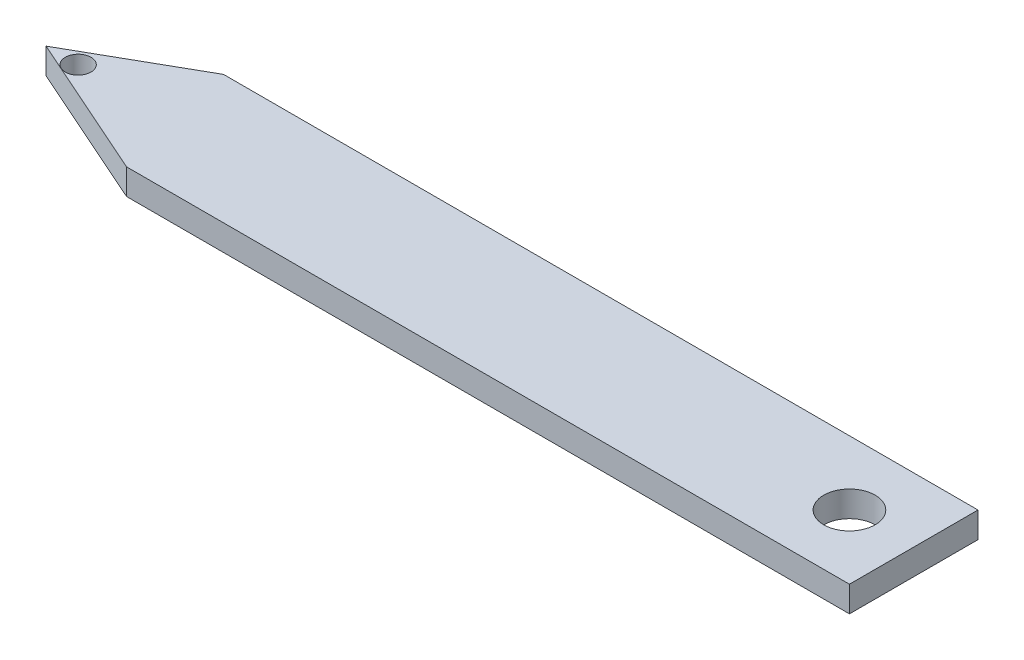
ISO-10303-21;
HEADER;
FILE_DESCRIPTION(('STEP AP214'),'2;1');
FILE_NAME('part.step','',(''),(''),'','','');
FILE_SCHEMA(('AUTOMOTIVE_DESIGN { 1 0 10303 214 1 1 1 1 }'));
ENDSEC;
DATA;
#1=APPLICATION_CONTEXT('core data for automotive mechanical design processes');
#2=APPLICATION_PROTOCOL_DEFINITION('international standard','automotive_design',2000,#1);
#3=PRODUCT_CONTEXT('',#1,'mechanical');
#4=PRODUCT('Part','Part','',(#3));
#5=PRODUCT_RELATED_PRODUCT_CATEGORY('part','',(#4));
#6=PRODUCT_DEFINITION_FORMATION('','',#4);
#7=PRODUCT_DEFINITION_CONTEXT('part definition',#1,'design');
#8=PRODUCT_DEFINITION('design','',#6,#7);
#9=PRODUCT_DEFINITION_SHAPE('','',#8);
#10=(LENGTH_UNIT() NAMED_UNIT(*) SI_UNIT(.MILLI.,.METRE.));
#11=(NAMED_UNIT(*) PLANE_ANGLE_UNIT() SI_UNIT($,.RADIAN.));
#12=(NAMED_UNIT(*) SI_UNIT($,.STERADIAN.) SOLID_ANGLE_UNIT());
#13=UNCERTAINTY_MEASURE_WITH_UNIT(LENGTH_MEASURE(1.E-05),#10,'distance_accuracy_value','');
#14=(GEOMETRIC_REPRESENTATION_CONTEXT(3) GLOBAL_UNCERTAINTY_ASSIGNED_CONTEXT((#13)) GLOBAL_UNIT_ASSIGNED_CONTEXT((#10,
#11,#12)) REPRESENTATION_CONTEXT('',''));
#15=CARTESIAN_POINT('',(0.,0.,0.));
#16=DIRECTION('',(0.,0.,1.));
#17=DIRECTION('',(1.,0.,0.));
#18=AXIS2_PLACEMENT_3D('',#15,#16,#17);
#19=CARTESIAN_POINT('',(0.,2.,0.));
#20=DIRECTION('',(0.,1.,0.));
#21=DIRECTION('',(0.,0.,1.));
#22=AXIS2_PLACEMENT_3D('',#19,#20,#21);
#23=PLANE('',#22);
#24=DIRECTION('',(-0.91411111385372,0.,-0.405463773386861));
#25=VECTOR('',#24,1.);
#26=CARTESIAN_POINT('',(-14.9325378072298,2.,4.37061323258042));
#27=LINE('',#26,#25);
#28=CARTESIAN_POINT('',(-14.9325378072298,2.,4.37061323258042));
#29=VERTEX_POINT('',#28);
#30=CARTESIAN_POINT('',(-26.2049519395467,2.,-0.629386767419544));
#31=VERTEX_POINT('',#30);
#32=EDGE_CURVE('E120',#29,#31,#27,.T.);
#33=ORIENTED_EDGE('',*,*,#32,.F.);
#34=DIRECTION('',(1.,0.,0.));
#35=VECTOR('',#34,1.);
#36=CARTESIAN_POINT('',(-26.2049519395467,2.,4.37061323258042));
#37=LINE('',#36,#35);
#38=CARTESIAN_POINT('',(41.2950480604534,2.,4.37061323258042));
#39=VERTEX_POINT('',#38);
#40=EDGE_CURVE('E90',#29,#39,#37,.T.);
#41=ORIENTED_EDGE('',*,*,#40,.T.);
#42=DIRECTION('',(0.,0.,-1.));
#43=VECTOR('',#42,1.);
#44=CARTESIAN_POINT('',(41.2950480604534,2.,-5.62938676741958));
#45=LINE('',#44,#43);
#46=CARTESIAN_POINT('',(41.2950480604534,2.,-5.62938676741958));
#47=VERTEX_POINT('',#46);
#48=EDGE_CURVE('E56',#39,#47,#45,.T.);
#49=ORIENTED_EDGE('',*,*,#48,.T.);
#50=DIRECTION('',(-1.,0.,0.));
#51=VECTOR('',#50,1.);
#52=CARTESIAN_POINT('',(-26.2049519395467,2.,-5.62938676741958));
#53=LINE('',#52,#51);
#54=CARTESIAN_POINT('',(-17.3953025996241,2.,-5.62938676741958));
#55=VERTEX_POINT('',#54);
#56=EDGE_CURVE('E83',#47,#55,#53,.T.);
#57=ORIENTED_EDGE('',*,*,#56,.T.);
#58=DIRECTION('',(0.869688934575392,0.,-0.493600199632374));
#59=VECTOR('',#58,1.);
#60=CARTESIAN_POINT('',(-26.2049519395467,2.,-0.629386767419544));
#61=LINE('',#60,#59);
#62=EDGE_CURVE('E47',#31,#55,#61,.T.);
#63=ORIENTED_EDGE('',*,*,#62,.F.);
#64=EDGE_LOOP('',(#33,#41,#49,#57,#63));
#65=FACE_BOUND('',#64,.T.);
#66=CARTESIAN_POINT('',(-23.7049519395466,2.,-0.629386767419579));
#67=DIRECTION('',(0.,1.,0.));
#68=DIRECTION('',(0.,0.,1.));
#69=AXIS2_PLACEMENT_3D('',#66,#67,#68);
#70=CIRCLE('',#69,1.);
#71=CARTESIAN_POINT('',(-23.7049519395466,2.,0.370613232580422));
#72=VERTEX_POINT('',#71);
#73=EDGE_CURVE('E95',#72,#72,#70,.T.);
#74=ORIENTED_EDGE('',*,*,#73,.F.);
#75=EDGE_LOOP('',(#74));
#76=FACE_BOUND('',#75,.T.);
#77=CARTESIAN_POINT('',(36.2950480604534,2.,-0.629386767419579));
#78=DIRECTION('',(0.,1.,0.));
#79=DIRECTION('',(0.,0.,1.));
#80=AXIS2_PLACEMENT_3D('',#77,#78,#79);
#81=CIRCLE('',#80,2.);
#82=CARTESIAN_POINT('',(36.2950480604534,2.,1.37061323258042));
#83=VERTEX_POINT('',#82);
#84=EDGE_CURVE('E101',#83,#83,#81,.T.);
#85=ORIENTED_EDGE('',*,*,#84,.F.);
#86=EDGE_LOOP('',(#85));
#87=FACE_BOUND('',#86,.T.);
#88=ADVANCED_FACE('F32',(#65,#76,#87),#23,.T.);
#89=CARTESIAN_POINT('',(0.,0.,0.));
#90=DIRECTION('',(0.,1.,0.));
#91=DIRECTION('',(0.,0.,1.));
#92=AXIS2_PLACEMENT_3D('',#89,#90,#91);
#93=PLANE('',#92);
#94=DIRECTION('',(1.,0.,0.));
#95=VECTOR('',#94,1.);
#96=CARTESIAN_POINT('',(-26.2049519395467,0.,4.37061323258042));
#97=LINE('',#96,#95);
#98=CARTESIAN_POINT('',(-14.9325378072298,0.,4.37061323258042));
#99=VERTEX_POINT('',#98);
#100=CARTESIAN_POINT('',(41.2950480604534,0.,4.37061323258042));
#101=VERTEX_POINT('',#100);
#102=EDGE_CURVE('E77',#99,#101,#97,.T.);
#103=ORIENTED_EDGE('',*,*,#102,.F.);
#104=DIRECTION('',(-0.91411111385372,0.,-0.405463773386861));
#105=VECTOR('',#104,1.);
#106=CARTESIAN_POINT('',(-4.07484169195814,0.,9.18666061507664));
#107=LINE('',#106,#105);
#108=CARTESIAN_POINT('',(-26.2049519395467,0.,-0.629386767419544));
#109=VERTEX_POINT('',#108);
#110=EDGE_CURVE('E107',#99,#109,#107,.T.);
#111=ORIENTED_EDGE('',*,*,#110,.T.);
#112=DIRECTION('',(0.869688934575392,0.,-0.493600199632374));
#113=VECTOR('',#112,1.);
#114=CARTESIAN_POINT('',(-6.65478710204479,0.,-11.7252681601708));
#115=LINE('',#114,#113);
#116=CARTESIAN_POINT('',(-17.3953025996241,0.,-5.62938676741958));
#117=VERTEX_POINT('',#116);
#118=EDGE_CURVE('E89',#109,#117,#115,.T.);
#119=ORIENTED_EDGE('',*,*,#118,.T.);
#120=DIRECTION('',(-1.,0.,0.));
#121=VECTOR('',#120,1.);
#122=CARTESIAN_POINT('',(-26.2049519395467,0.,-5.62938676741958));
#123=LINE('',#122,#121);
#124=CARTESIAN_POINT('',(41.2950480604534,0.,-5.62938676741958));
#125=VERTEX_POINT('',#124);
#126=EDGE_CURVE('E76',#125,#117,#123,.T.);
#127=ORIENTED_EDGE('',*,*,#126,.F.);
#128=DIRECTION('',(0.,0.,-1.));
#129=VECTOR('',#128,1.);
#130=CARTESIAN_POINT('',(41.2950480604534,0.,-5.62938676741958));
#131=LINE('',#130,#129);
#132=EDGE_CURVE('E68',#101,#125,#131,.T.);
#133=ORIENTED_EDGE('',*,*,#132,.F.);
#134=EDGE_LOOP('',(#103,#111,#119,#127,#133));
#135=FACE_BOUND('',#134,.T.);
#136=CARTESIAN_POINT('',(-23.7049519395466,0.,-0.629386767419579));
#137=DIRECTION('',(0.,1.,0.));
#138=DIRECTION('',(0.,0.,1.));
#139=AXIS2_PLACEMENT_3D('',#136,#137,#138);
#140=CIRCLE('',#139,1.);
#141=CARTESIAN_POINT('',(-23.7049519395466,0.,0.370613232580422));
#142=VERTEX_POINT('',#141);
#143=EDGE_CURVE('E98',#142,#142,#140,.T.);
#144=ORIENTED_EDGE('',*,*,#143,.T.);
#145=EDGE_LOOP('',(#144));
#146=FACE_BOUND('',#145,.T.);
#147=CARTESIAN_POINT('',(36.2950480604534,0.,-0.629386767419579));
#148=DIRECTION('',(0.,1.,0.));
#149=DIRECTION('',(0.,0.,1.));
#150=AXIS2_PLACEMENT_3D('',#147,#148,#149);
#151=CIRCLE('',#150,2.);
#152=CARTESIAN_POINT('',(36.2950480604534,0.,1.37061323258042));
#153=VERTEX_POINT('',#152);
#154=EDGE_CURVE('E104',#153,#153,#151,.T.);
#155=ORIENTED_EDGE('',*,*,#154,.T.);
#156=EDGE_LOOP('',(#155));
#157=FACE_BOUND('',#156,.T.);
#158=ADVANCED_FACE('F85',(#135,#146,#157),#93,.F.);
#159=CARTESIAN_POINT('',(-26.2049519395467,2.,4.37061323258042));
#160=DIRECTION('',(0.,0.,-1.));
#161=DIRECTION('',(-1.,0.,0.));
#162=AXIS2_PLACEMENT_3D('',#159,#160,#161);
#163=PLANE('',#162);
#164=ORIENTED_EDGE('',*,*,#40,.F.);
#165=DIRECTION('',(0.,1.,0.));
#166=VECTOR('',#165,1.);
#167=CARTESIAN_POINT('',(-14.9325378072298,-8.,4.37061323258042));
#168=LINE('',#167,#166);
#169=EDGE_CURVE('E112',#99,#29,#168,.T.);
#170=ORIENTED_EDGE('',*,*,#169,.F.);
#171=ORIENTED_EDGE('',*,*,#102,.T.);
#172=DIRECTION('',(0.,-1.,0.));
#173=VECTOR('',#172,1.);
#174=CARTESIAN_POINT('',(41.2950480604534,2.,4.37061323258042));
#175=LINE('',#174,#173);
#176=EDGE_CURVE('E11',#39,#101,#175,.T.);
#177=ORIENTED_EDGE('',*,*,#176,.F.);
#178=EDGE_LOOP('',(#164,#170,#171,#177));
#179=FACE_BOUND('',#178,.T.);
#180=ADVANCED_FACE('F34',(#179),#163,.F.);
#181=CARTESIAN_POINT('',(41.2950480604534,2.,-5.62938676741958));
#182=DIRECTION('',(-1.,0.,0.));
#183=DIRECTION('',(0.,0.,1.));
#184=AXIS2_PLACEMENT_3D('',#181,#182,#183);
#185=PLANE('',#184);
#186=ORIENTED_EDGE('',*,*,#132,.T.);
#187=DIRECTION('',(0.,-1.,0.));
#188=VECTOR('',#187,1.);
#189=CARTESIAN_POINT('',(41.2950480604534,2.,-5.62938676741958));
#190=LINE('',#189,#188);
#191=EDGE_CURVE('E40',#47,#125,#190,.T.);
#192=ORIENTED_EDGE('',*,*,#191,.F.);
#193=ORIENTED_EDGE('',*,*,#48,.F.);
#194=ORIENTED_EDGE('',*,*,#176,.T.);
#195=EDGE_LOOP('',(#186,#192,#193,#194));
#196=FACE_BOUND('',#195,.T.);
#197=ADVANCED_FACE('F70',(#196),#185,.F.);
#198=CARTESIAN_POINT('',(-26.2049519395467,2.,-5.62938676741958));
#199=DIRECTION('',(0.,0.,1.));
#200=DIRECTION('',(1.,0.,0.));
#201=AXIS2_PLACEMENT_3D('',#198,#199,#200);
#202=PLANE('',#201);
#203=ORIENTED_EDGE('',*,*,#126,.T.);
#204=DIRECTION('',(0.,1.,0.));
#205=VECTOR('',#204,1.);
#206=CARTESIAN_POINT('',(-17.3953025996241,-8.,-5.62938676741958));
#207=LINE('',#206,#205);
#208=EDGE_CURVE('E115',#117,#55,#207,.T.);
#209=ORIENTED_EDGE('',*,*,#208,.T.);
#210=ORIENTED_EDGE('',*,*,#56,.F.);
#211=ORIENTED_EDGE('',*,*,#191,.T.);
#212=EDGE_LOOP('',(#203,#209,#210,#211));
#213=FACE_BOUND('',#212,.T.);
#214=ADVANCED_FACE('F81',(#213),#202,.F.);
#215=CARTESIAN_POINT('',(-23.7049519395466,2.,-0.629386767419579));
#216=DIRECTION('',(0.,-1.,0.));
#217=DIRECTION('',(0.,0.,-1.));
#218=AXIS2_PLACEMENT_3D('',#215,#216,#217);
#219=CYLINDRICAL_SURFACE('',#218,1.);
#220=ORIENTED_EDGE('',*,*,#73,.T.);
#221=EDGE_LOOP('',(#220));
#222=FACE_BOUND('',#221,.T.);
#223=ORIENTED_EDGE('',*,*,#143,.F.);
#224=EDGE_LOOP('',(#223));
#225=FACE_BOUND('',#224,.T.);
#226=ADVANCED_FACE('F143',(#222,#225),#219,.F.);
#227=CARTESIAN_POINT('',(36.2950480604534,2.,-0.629386767419579));
#228=DIRECTION('',(0.,-1.,0.));
#229=DIRECTION('',(0.,0.,-1.));
#230=AXIS2_PLACEMENT_3D('',#227,#228,#229);
#231=CYLINDRICAL_SURFACE('',#230,2.);
#232=ORIENTED_EDGE('',*,*,#84,.T.);
#233=EDGE_LOOP('',(#232));
#234=FACE_BOUND('',#233,.T.);
#235=ORIENTED_EDGE('',*,*,#154,.F.);
#236=EDGE_LOOP('',(#235));
#237=FACE_BOUND('',#236,.T.);
#238=ADVANCED_FACE('F140',(#234,#237),#231,.F.);
#239=CARTESIAN_POINT('',(-14.9325378072298,-8.,4.37061323258042));
#240=DIRECTION('',(0.405463773386861,0.,-0.91411111385372));
#241=DIRECTION('',(-0.91411111385372,0.,-0.405463773386861));
#242=AXIS2_PLACEMENT_3D('',#239,#240,#241);
#243=PLANE('',#242);
#244=ORIENTED_EDGE('',*,*,#169,.T.);
#245=ORIENTED_EDGE('',*,*,#32,.T.);
#246=DIRECTION('',(0.,1.,0.));
#247=VECTOR('',#246,1.);
#248=CARTESIAN_POINT('',(-26.2049519395467,-8.,-0.629386767419544));
#249=LINE('',#248,#247);
#250=EDGE_CURVE('E113',#109,#31,#249,.T.);
#251=ORIENTED_EDGE('',*,*,#250,.F.);
#252=ORIENTED_EDGE('',*,*,#110,.F.);
#253=EDGE_LOOP('',(#244,#245,#251,#252));
#254=FACE_BOUND('',#253,.T.);
#255=ADVANCED_FACE('F126',(#254),#243,.F.);
#256=CARTESIAN_POINT('',(-26.2049519395467,-8.,-0.629386767419544));
#257=DIRECTION('',(0.493600199632374,0.,0.869688934575392));
#258=DIRECTION('',(0.869688934575392,0.,-0.493600199632374));
#259=AXIS2_PLACEMENT_3D('',#256,#257,#258);
#260=PLANE('',#259);
#261=ORIENTED_EDGE('',*,*,#250,.T.);
#262=ORIENTED_EDGE('',*,*,#62,.T.);
#263=ORIENTED_EDGE('',*,*,#208,.F.);
#264=ORIENTED_EDGE('',*,*,#118,.F.);
#265=EDGE_LOOP('',(#261,#262,#263,#264));
#266=FACE_BOUND('',#265,.T.);
#267=ADVANCED_FACE('F182',(#266),#260,.F.);
#268=CLOSED_SHELL('',(#88,#158,#180,#197,#214,#226,#238,#255,#267));
#269=MANIFOLD_SOLID_BREP('B2',#268);
#270=ADVANCED_BREP_SHAPE_REPRESENTATION('',(#18,#269),#14);
#271=SHAPE_DEFINITION_REPRESENTATION(#9,#270);
ENDSEC;
END-ISO-10303-21;
